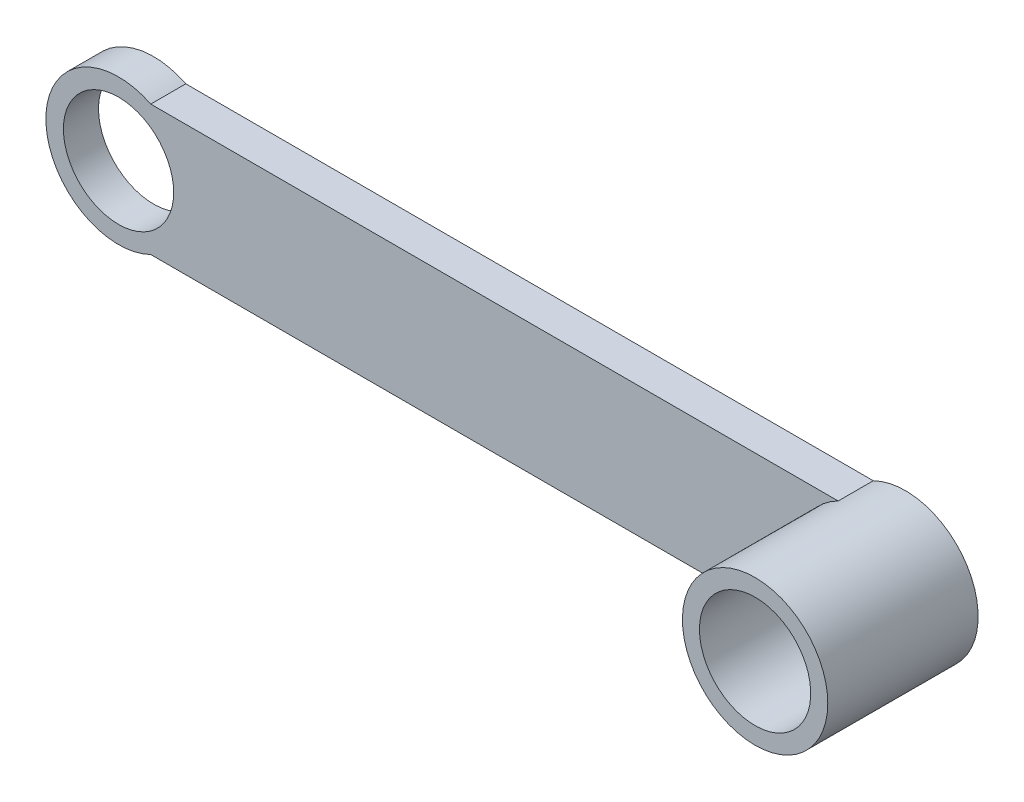
ISO-10303-21;
HEADER;
FILE_DESCRIPTION(('STEP AP214'),'2;1');
FILE_NAME('part.step','',(''),(''),'','','');
FILE_SCHEMA(('AUTOMOTIVE_DESIGN { 1 0 10303 214 1 1 1 1 }'));
ENDSEC;
DATA;
#1=APPLICATION_CONTEXT('core data for automotive mechanical design processes');
#2=APPLICATION_PROTOCOL_DEFINITION('international standard','automotive_design',2000,#1);
#3=PRODUCT_CONTEXT('',#1,'mechanical');
#4=PRODUCT('Part','Part','',(#3));
#5=PRODUCT_RELATED_PRODUCT_CATEGORY('part','',(#4));
#6=PRODUCT_DEFINITION_FORMATION('','',#4);
#7=PRODUCT_DEFINITION_CONTEXT('part definition',#1,'design');
#8=PRODUCT_DEFINITION('design','',#6,#7);
#9=PRODUCT_DEFINITION_SHAPE('','',#8);
#10=(LENGTH_UNIT() NAMED_UNIT(*) SI_UNIT(.MILLI.,.METRE.));
#11=(NAMED_UNIT(*) PLANE_ANGLE_UNIT() SI_UNIT($,.RADIAN.));
#12=(NAMED_UNIT(*) SI_UNIT($,.STERADIAN.) SOLID_ANGLE_UNIT());
#13=UNCERTAINTY_MEASURE_WITH_UNIT(LENGTH_MEASURE(1.E-05),#10,'distance_accuracy_value','');
#14=(GEOMETRIC_REPRESENTATION_CONTEXT(3) GLOBAL_UNCERTAINTY_ASSIGNED_CONTEXT((#13)) GLOBAL_UNIT_ASSIGNED_CONTEXT((#10,
#11,#12)) REPRESENTATION_CONTEXT('',''));
#15=CARTESIAN_POINT('',(0.,0.,0.));
#16=DIRECTION('',(0.,0.,1.));
#17=DIRECTION('',(1.,0.,0.));
#18=AXIS2_PLACEMENT_3D('',#15,#16,#17);
#19=CARTESIAN_POINT('',(-75.,0.,7.));
#20=DIRECTION('',(0.,0.,-1.));
#21=DIRECTION('',(-1.,0.,0.));
#22=AXIS2_PLACEMENT_3D('',#19,#20,#21);
#23=CYLINDRICAL_SURFACE('',#22,14.5);
#24=CARTESIAN_POINT('',(-75.,0.,0.));
#25=DIRECTION('',(0.,0.,1.));
#26=DIRECTION('',(1.,0.,0.));
#27=AXIS2_PLACEMENT_3D('',#24,#25,#26);
#28=CIRCLE('',#27,14.5);
#29=CARTESIAN_POINT('',(-68.5773837106674,13.,0.));
#30=VERTEX_POINT('',#29);
#31=CARTESIAN_POINT('',(-68.5773837106674,-13.,0.));
#32=VERTEX_POINT('',#31);
#33=EDGE_CURVE('E97',#30,#32,#28,.T.);
#34=ORIENTED_EDGE('',*,*,#33,.T.);
#35=DIRECTION('',(0.,0.,-1.));
#36=VECTOR('',#35,1.);
#37=CARTESIAN_POINT('',(-68.5773837106674,-13.,7.));
#38=LINE('',#37,#36);
#39=CARTESIAN_POINT('',(-68.5773837106674,-13.,7.));
#40=VERTEX_POINT('',#39);
#41=EDGE_CURVE('E11',#40,#32,#38,.T.);
#42=ORIENTED_EDGE('',*,*,#41,.F.);
#43=CARTESIAN_POINT('',(-75.,0.,7.));
#44=DIRECTION('',(0.,0.,1.));
#45=DIRECTION('',(1.,0.,0.));
#46=AXIS2_PLACEMENT_3D('',#43,#44,#45);
#47=CIRCLE('',#46,14.5);
#48=CARTESIAN_POINT('',(-68.5773837106674,13.,7.));
#49=VERTEX_POINT('',#48);
#50=EDGE_CURVE('E104',#49,#40,#47,.T.);
#51=ORIENTED_EDGE('',*,*,#50,.F.);
#52=DIRECTION('',(0.,0.,-1.));
#53=VECTOR('',#52,1.);
#54=CARTESIAN_POINT('',(-68.5773837106674,13.,7.));
#55=LINE('',#54,#53);
#56=EDGE_CURVE('E84',#49,#30,#55,.T.);
#57=ORIENTED_EDGE('',*,*,#56,.T.);
#58=EDGE_LOOP('',(#34,#42,#51,#57));
#59=FACE_BOUND('',#58,.T.);
#60=ADVANCED_FACE('F33',(#59),#23,.T.);
#61=CARTESIAN_POINT('',(-68.5773837106674,-13.,7.));
#62=DIRECTION('',(0.,1.,0.));
#63=DIRECTION('',(0.,0.,1.));
#64=AXIS2_PLACEMENT_3D('',#61,#62,#63);
#65=PLANE('',#64);
#66=DIRECTION('',(1.,0.,0.));
#67=VECTOR('',#66,1.);
#68=CARTESIAN_POINT('',(-68.5773837106674,-13.,0.));
#69=LINE('',#68,#67);
#70=CARTESIAN_POINT('',(68.5773837106674,-13.,0.));
#71=VERTEX_POINT('',#70);
#72=EDGE_CURVE('E120',#32,#71,#69,.T.);
#73=ORIENTED_EDGE('',*,*,#72,.T.);
#74=DIRECTION('',(0.,0.,-1.));
#75=VECTOR('',#74,1.);
#76=CARTESIAN_POINT('',(68.5773837106674,-13.,7.));
#77=LINE('',#76,#75);
#78=CARTESIAN_POINT('',(68.5773837106674,-13.,7.));
#79=VERTEX_POINT('',#78);
#80=EDGE_CURVE('E42',#79,#71,#77,.T.);
#81=ORIENTED_EDGE('',*,*,#80,.F.);
#82=DIRECTION('',(1.,0.,0.));
#83=VECTOR('',#82,1.);
#84=CARTESIAN_POINT('',(-68.5773837106674,-13.,7.));
#85=LINE('',#84,#83);
#86=EDGE_CURVE('E80',#40,#79,#85,.T.);
#87=ORIENTED_EDGE('',*,*,#86,.F.);
#88=ORIENTED_EDGE('',*,*,#41,.T.);
#89=EDGE_LOOP('',(#73,#81,#87,#88));
#90=FACE_BOUND('',#89,.T.);
#91=ADVANCED_FACE('F127',(#90),#65,.F.);
#92=CARTESIAN_POINT('',(75.,0.,7.));
#93=DIRECTION('',(0.,0.,-1.));
#94=DIRECTION('',(-1.,0.,0.));
#95=AXIS2_PLACEMENT_3D('',#92,#93,#94);
#96=CYLINDRICAL_SURFACE('',#95,14.5);
#97=CARTESIAN_POINT('',(75.,0.,0.));
#98=DIRECTION('',(0.,0.,1.));
#99=DIRECTION('',(1.,0.,0.));
#100=AXIS2_PLACEMENT_3D('',#97,#98,#99);
#101=CIRCLE('',#100,14.5);
#102=CARTESIAN_POINT('',(68.5773837106674,13.,0.));
#103=VERTEX_POINT('',#102);
#104=EDGE_CURVE('E70',#71,#103,#101,.T.);
#105=ORIENTED_EDGE('',*,*,#104,.T.);
#106=DIRECTION('',(0.,0.,-1.));
#107=VECTOR('',#106,1.);
#108=CARTESIAN_POINT('',(68.5773837106674,13.,7.));
#109=LINE('',#108,#107);
#110=CARTESIAN_POINT('',(68.5773837106674,13.,7.));
#111=VERTEX_POINT('',#110);
#112=EDGE_CURVE('E83',#111,#103,#109,.T.);
#113=ORIENTED_EDGE('',*,*,#112,.F.);
#114=CARTESIAN_POINT('',(75.,0.,7.));
#115=DIRECTION('',(0.,0.,1.));
#116=DIRECTION('',(1.,0.,0.));
#117=AXIS2_PLACEMENT_3D('',#114,#115,#116);
#118=CIRCLE('',#117,14.5);
#119=EDGE_CURVE('E90',#111,#79,#118,.T.);
#120=ORIENTED_EDGE('',*,*,#119,.T.);
#121=ORIENTED_EDGE('',*,*,#80,.T.);
#122=EDGE_LOOP('',(#105,#113,#120,#121));
#123=FACE_BOUND('',#122,.T.);
#124=CARTESIAN_POINT('',(75.,0.,30.));
#125=DIRECTION('',(0.,0.,1.));
#126=DIRECTION('',(1.,0.,0.));
#127=AXIS2_PLACEMENT_3D('',#124,#125,#126);
#128=CIRCLE('',#127,14.5);
#129=CARTESIAN_POINT('',(89.5,0.,30.));
#130=VERTEX_POINT('',#129);
#131=EDGE_CURVE('E93',#130,#130,#128,.T.);
#132=ORIENTED_EDGE('',*,*,#131,.F.);
#133=EDGE_LOOP('',(#132));
#134=FACE_BOUND('',#133,.T.);
#135=ADVANCED_FACE('F88',(#123,#134),#96,.T.);
#136=CARTESIAN_POINT('',(-68.5773837106674,13.,7.));
#137=DIRECTION('',(0.,-1.,0.));
#138=DIRECTION('',(1.,0.,0.));
#139=AXIS2_PLACEMENT_3D('',#136,#137,#138);
#140=PLANE('',#139);
#141=DIRECTION('',(-1.,0.,0.));
#142=VECTOR('',#141,1.);
#143=CARTESIAN_POINT('',(-68.5773837106674,13.,0.));
#144=LINE('',#143,#142);
#145=EDGE_CURVE('E75',#103,#30,#144,.T.);
#146=ORIENTED_EDGE('',*,*,#145,.T.);
#147=ORIENTED_EDGE('',*,*,#56,.F.);
#148=DIRECTION('',(-1.,0.,0.));
#149=VECTOR('',#148,1.);
#150=CARTESIAN_POINT('',(-68.5773837106674,13.,7.));
#151=LINE('',#150,#149);
#152=EDGE_CURVE('E51',#111,#49,#151,.T.);
#153=ORIENTED_EDGE('',*,*,#152,.F.);
#154=ORIENTED_EDGE('',*,*,#112,.T.);
#155=EDGE_LOOP('',(#146,#147,#153,#154));
#156=FACE_BOUND('',#155,.T.);
#157=ADVANCED_FACE('F82',(#156),#140,.F.);
#158=CARTESIAN_POINT('',(-75.,0.,7.));
#159=DIRECTION('',(0.,0.,1.));
#160=DIRECTION('',(1.,0.,0.));
#161=AXIS2_PLACEMENT_3D('',#158,#159,#160);
#162=PLANE('',#161);
#163=CARTESIAN_POINT('',(-75.,0.,7.));
#164=DIRECTION('',(0.,0.,1.));
#165=DIRECTION('',(1.,0.,0.));
#166=AXIS2_PLACEMENT_3D('',#163,#164,#165);
#167=CIRCLE('',#166,11.);
#168=CARTESIAN_POINT('',(-64.,0.,7.));
#169=VERTEX_POINT('',#168);
#170=EDGE_CURVE('E100',#169,#169,#167,.T.);
#171=ORIENTED_EDGE('',*,*,#170,.F.);
#172=EDGE_LOOP('',(#171));
#173=FACE_BOUND('',#172,.T.);
#174=ORIENTED_EDGE('',*,*,#119,.F.);
#175=ORIENTED_EDGE('',*,*,#152,.T.);
#176=ORIENTED_EDGE('',*,*,#50,.T.);
#177=ORIENTED_EDGE('',*,*,#86,.T.);
#178=EDGE_LOOP('',(#174,#175,#176,#177));
#179=FACE_BOUND('',#178,.T.);
#180=ADVANCED_FACE('F92',(#173,#179),#162,.T.);
#181=CARTESIAN_POINT('',(-75.,0.,0.));
#182=DIRECTION('',(0.,0.,1.));
#183=DIRECTION('',(1.,0.,0.));
#184=AXIS2_PLACEMENT_3D('',#181,#182,#183);
#185=PLANE('',#184);
#186=CARTESIAN_POINT('',(-75.,0.,0.));
#187=DIRECTION('',(0.,0.,-1.));
#188=DIRECTION('',(-1.,0.,0.));
#189=AXIS2_PLACEMENT_3D('',#186,#187,#188);
#190=CIRCLE('',#189,11.);
#191=CARTESIAN_POINT('',(-86.,0.,0.));
#192=VERTEX_POINT('',#191);
#193=EDGE_CURVE('E170',#192,#192,#190,.T.);
#194=ORIENTED_EDGE('',*,*,#193,.F.);
#195=EDGE_LOOP('',(#194));
#196=FACE_BOUND('',#195,.T.);
#197=CARTESIAN_POINT('',(75.,0.,0.));
#198=DIRECTION('',(0.,0.,-1.));
#199=DIRECTION('',(-1.,0.,0.));
#200=AXIS2_PLACEMENT_3D('',#197,#198,#199);
#201=CIRCLE('',#200,11.);
#202=CARTESIAN_POINT('',(64.,0.,0.));
#203=VERTEX_POINT('',#202);
#204=EDGE_CURVE('E94',#203,#203,#201,.T.);
#205=ORIENTED_EDGE('',*,*,#204,.F.);
#206=EDGE_LOOP('',(#205));
#207=FACE_BOUND('',#206,.T.);
#208=ORIENTED_EDGE('',*,*,#33,.F.);
#209=ORIENTED_EDGE('',*,*,#145,.F.);
#210=ORIENTED_EDGE('',*,*,#104,.F.);
#211=ORIENTED_EDGE('',*,*,#72,.F.);
#212=EDGE_LOOP('',(#208,#209,#210,#211));
#213=FACE_BOUND('',#212,.T.);
#214=ADVANCED_FACE('F119',(#196,#207,#213),#185,.F.);
#215=CARTESIAN_POINT('',(75.,0.,30.));
#216=DIRECTION('',(0.,0.,1.));
#217=DIRECTION('',(1.,0.,0.));
#218=AXIS2_PLACEMENT_3D('',#215,#216,#217);
#219=PLANE('',#218);
#220=CARTESIAN_POINT('',(75.,0.,30.));
#221=DIRECTION('',(0.,0.,-1.));
#222=DIRECTION('',(-1.,0.,0.));
#223=AXIS2_PLACEMENT_3D('',#220,#221,#222);
#224=CIRCLE('',#223,11.1);
#225=CARTESIAN_POINT('',(63.9,0.,30.));
#226=VERTEX_POINT('',#225);
#227=EDGE_CURVE('E171',#226,#226,#224,.T.);
#228=ORIENTED_EDGE('',*,*,#227,.T.);
#229=EDGE_LOOP('',(#228));
#230=FACE_BOUND('',#229,.T.);
#231=ORIENTED_EDGE('',*,*,#131,.T.);
#232=EDGE_LOOP('',(#231));
#233=FACE_BOUND('',#232,.T.);
#234=ADVANCED_FACE('F139',(#230,#233),#219,.T.);
#235=CARTESIAN_POINT('',(75.,0.,30.));
#236=DIRECTION('',(0.,0.,-1.));
#237=DIRECTION('',(-1.,0.,0.));
#238=AXIS2_PLACEMENT_3D('',#235,#236,#237);
#239=CYLINDRICAL_SURFACE('',#238,11.);
#240=CARTESIAN_POINT('',(75.,0.,7.));
#241=DIRECTION('',(0.,0.,-1.));
#242=DIRECTION('',(-1.,0.,0.));
#243=AXIS2_PLACEMENT_3D('',#240,#241,#242);
#244=CIRCLE('',#243,11.);
#245=CARTESIAN_POINT('',(64.,0.,7.));
#246=VERTEX_POINT('',#245);
#247=EDGE_CURVE('E36',#246,#246,#244,.F.);
#248=ORIENTED_EDGE('',*,*,#247,.T.);
#249=EDGE_LOOP('',(#248));
#250=FACE_BOUND('',#249,.T.);
#251=ORIENTED_EDGE('',*,*,#204,.T.);
#252=EDGE_LOOP('',(#251));
#253=FACE_BOUND('',#252,.T.);
#254=ADVANCED_FACE('F146',(#250,#253),#239,.F.);
#255=CARTESIAN_POINT('',(-75.,0.,30.));
#256=DIRECTION('',(0.,0.,-1.));
#257=DIRECTION('',(-1.,0.,0.));
#258=AXIS2_PLACEMENT_3D('',#255,#256,#257);
#259=CYLINDRICAL_SURFACE('',#258,11.);
#260=ORIENTED_EDGE('',*,*,#170,.T.);
#261=EDGE_LOOP('',(#260));
#262=FACE_BOUND('',#261,.T.);
#263=ORIENTED_EDGE('',*,*,#193,.T.);
#264=EDGE_LOOP('',(#263));
#265=FACE_BOUND('',#264,.T.);
#266=ADVANCED_FACE('F150',(#262,#265),#259,.F.);
#267=CARTESIAN_POINT('',(75.,0.,7.));
#268=DIRECTION('',(0.,0.,-1.));
#269=DIRECTION('',(-1.,0.,0.));
#270=AXIS2_PLACEMENT_3D('',#267,#268,#269);
#271=PLANE('',#270);
#272=CARTESIAN_POINT('',(75.,0.,7.));
#273=DIRECTION('',(0.,0.,-1.));
#274=DIRECTION('',(-1.,0.,0.));
#275=AXIS2_PLACEMENT_3D('',#272,#273,#274);
#276=CIRCLE('',#275,11.1);
#277=CARTESIAN_POINT('',(63.9,0.,7.));
#278=VERTEX_POINT('',#277);
#279=EDGE_CURVE('E167',#278,#278,#276,.T.);
#280=ORIENTED_EDGE('',*,*,#279,.F.);
#281=EDGE_LOOP('',(#280));
#282=FACE_BOUND('',#281,.T.);
#283=ORIENTED_EDGE('',*,*,#247,.F.);
#284=EDGE_LOOP('',(#283));
#285=FACE_BOUND('',#284,.T.);
#286=ADVANCED_FACE('F154',(#282,#285),#271,.F.);
#287=CARTESIAN_POINT('',(75.,0.,30.));
#288=DIRECTION('',(0.,0.,-1.));
#289=DIRECTION('',(-1.,0.,0.));
#290=AXIS2_PLACEMENT_3D('',#287,#288,#289);
#291=CYLINDRICAL_SURFACE('',#290,11.1);
#292=ORIENTED_EDGE('',*,*,#227,.F.);
#293=EDGE_LOOP('',(#292));
#294=FACE_BOUND('',#293,.T.);
#295=ORIENTED_EDGE('',*,*,#279,.T.);
#296=EDGE_LOOP('',(#295));
#297=FACE_BOUND('',#296,.T.);
#298=ADVANCED_FACE('F156',(#294,#297),#291,.F.);
#299=CLOSED_SHELL('',(#60,#91,#135,#157,#180,#214,#234,#254,#266,#286,#298));
#300=MANIFOLD_SOLID_BREP('B2',#299);
#301=ADVANCED_BREP_SHAPE_REPRESENTATION('',(#18,#300),#14);
#302=SHAPE_DEFINITION_REPRESENTATION(#9,#301);
ENDSEC;
END-ISO-10303-21;
